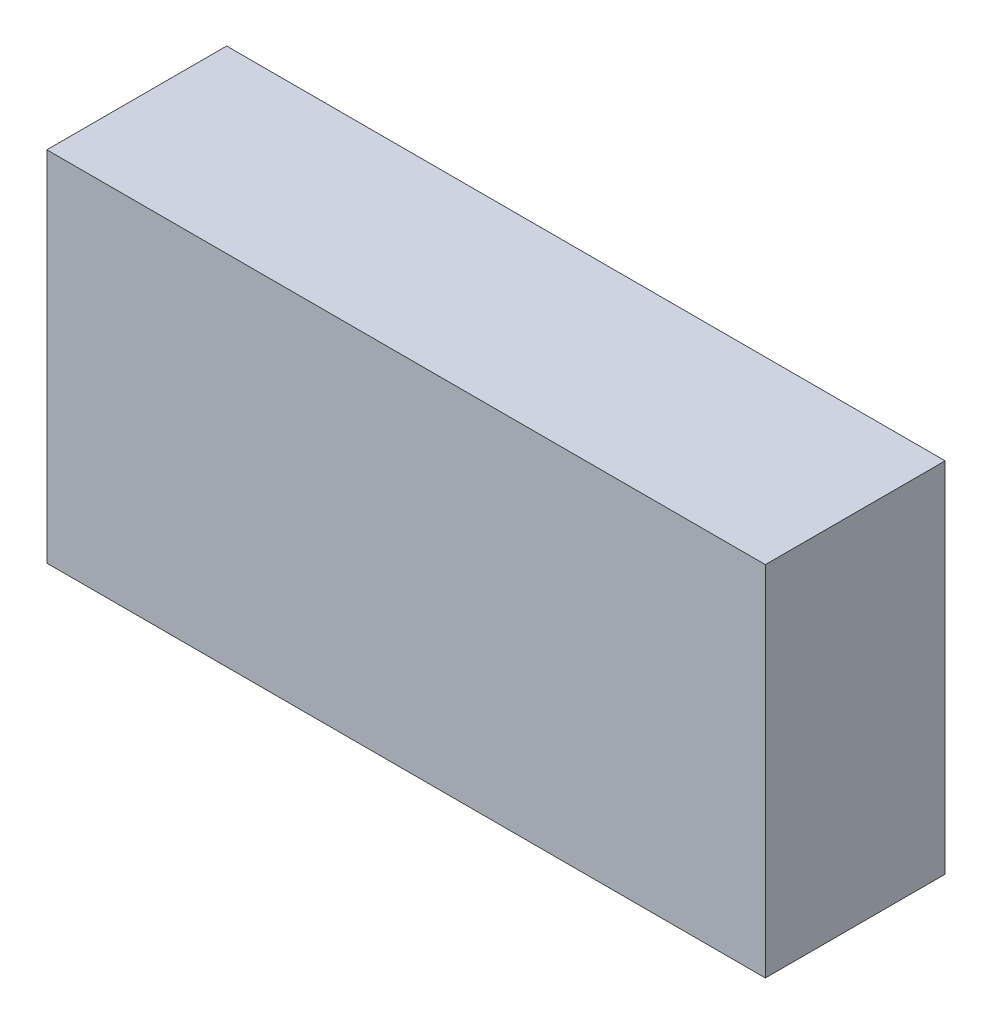
ISO-10303-21;
HEADER;
FILE_DESCRIPTION(('STEP AP214'),'2;1');
FILE_NAME('part.step','',(''),(''),'','','');
FILE_SCHEMA(('AUTOMOTIVE_DESIGN { 1 0 10303 214 1 1 1 1 }'));
ENDSEC;
DATA;
#1=APPLICATION_CONTEXT('core data for automotive mechanical design processes');
#2=APPLICATION_PROTOCOL_DEFINITION('international standard','automotive_design',2000,#1);
#3=PRODUCT_CONTEXT('',#1,'mechanical');
#4=PRODUCT('Part','Part','',(#3));
#5=PRODUCT_RELATED_PRODUCT_CATEGORY('part','',(#4));
#6=PRODUCT_DEFINITION_FORMATION('','',#4);
#7=PRODUCT_DEFINITION_CONTEXT('part definition',#1,'design');
#8=PRODUCT_DEFINITION('design','',#6,#7);
#9=PRODUCT_DEFINITION_SHAPE('','',#8);
#10=(LENGTH_UNIT() NAMED_UNIT(*) SI_UNIT(.MILLI.,.METRE.));
#11=(NAMED_UNIT(*) PLANE_ANGLE_UNIT() SI_UNIT($,.RADIAN.));
#12=(NAMED_UNIT(*) SI_UNIT($,.STERADIAN.) SOLID_ANGLE_UNIT());
#13=UNCERTAINTY_MEASURE_WITH_UNIT(LENGTH_MEASURE(1.E-05),#10,'distance_accuracy_value','');
#14=(GEOMETRIC_REPRESENTATION_CONTEXT(3) GLOBAL_UNCERTAINTY_ASSIGNED_CONTEXT((#13)) GLOBAL_UNIT_ASSIGNED_CONTEXT((#10,
#11,#12)) REPRESENTATION_CONTEXT('',''));
#15=CARTESIAN_POINT('',(0.,0.,0.));
#16=DIRECTION('',(0.,0.,1.));
#17=DIRECTION('',(1.,0.,0.));
#18=AXIS2_PLACEMENT_3D('',#15,#16,#17);
#19=CARTESIAN_POINT('',(-1.9984,1.0084,1.));
#20=DIRECTION('',(0.,0.,1.));
#21=DIRECTION('',(1.,0.,0.));
#22=AXIS2_PLACEMENT_3D('',#19,#20,#21);
#23=PLANE('',#22);
#24=DIRECTION('',(0.,1.,0.));
#25=VECTOR('',#24,1.);
#26=CARTESIAN_POINT('',(1.9984,1.0084,1.));
#27=LINE('',#26,#25);
#28=CARTESIAN_POINT('',(1.9984,1.0084,1.));
#29=VERTEX_POINT('',#28);
#30=CARTESIAN_POINT('',(1.9984,-0.983,1.));
#31=VERTEX_POINT('',#30);
#32=EDGE_CURVE('E53',#29,#31,#27,.F.);
#33=ORIENTED_EDGE('',*,*,#32,.F.);
#34=DIRECTION('',(1.,0.,0.));
#35=VECTOR('',#34,1.);
#36=CARTESIAN_POINT('',(-1.9984,1.0084,1.));
#37=LINE('',#36,#35);
#38=CARTESIAN_POINT('',(-1.9984,1.0084,1.));
#39=VERTEX_POINT('',#38);
#40=EDGE_CURVE('E68',#39,#29,#37,.T.);
#41=ORIENTED_EDGE('',*,*,#40,.F.);
#42=DIRECTION('',(0.,1.,0.));
#43=VECTOR('',#42,1.);
#44=CARTESIAN_POINT('',(-1.9984,-0.983,1.));
#45=LINE('',#44,#43);
#46=CARTESIAN_POINT('',(-1.9984,-0.983,1.));
#47=VERTEX_POINT('',#46);
#48=EDGE_CURVE('E20',#47,#39,#45,.T.);
#49=ORIENTED_EDGE('',*,*,#48,.F.);
#50=DIRECTION('',(1.,0.,0.));
#51=VECTOR('',#50,1.);
#52=CARTESIAN_POINT('',(1.9984,-0.983,1.));
#53=LINE('',#52,#51);
#54=EDGE_CURVE('E58',#31,#47,#53,.F.);
#55=ORIENTED_EDGE('',*,*,#54,.F.);
#56=EDGE_LOOP('',(#33,#41,#49,#55));
#57=FACE_BOUND('',#56,.T.);
#58=ADVANCED_FACE('F17',(#57),#23,.T.);
#59=CARTESIAN_POINT('',(-1.9984,-0.983,0.));
#60=DIRECTION('',(-1.,0.,0.));
#61=DIRECTION('',(0.,0.,1.));
#62=AXIS2_PLACEMENT_3D('',#59,#60,#61);
#63=PLANE('',#62);
#64=DIRECTION('',(0.,0.,1.));
#65=VECTOR('',#64,1.);
#66=CARTESIAN_POINT('',(-1.9984,1.0084,0.));
#67=LINE('',#66,#65);
#68=CARTESIAN_POINT('',(-1.9984,1.0084,0.));
#69=VERTEX_POINT('',#68);
#70=EDGE_CURVE('E79',#69,#39,#67,.T.);
#71=ORIENTED_EDGE('',*,*,#70,.F.);
#72=DIRECTION('',(0.,1.,0.));
#73=VECTOR('',#72,1.);
#74=CARTESIAN_POINT('',(-1.9984,1.0084,0.));
#75=LINE('',#74,#73);
#76=CARTESIAN_POINT('',(-1.9984,-0.983,0.));
#77=VERTEX_POINT('',#76);
#78=EDGE_CURVE('E74',#69,#77,#75,.F.);
#79=ORIENTED_EDGE('',*,*,#78,.T.);
#80=DIRECTION('',(0.,0.,-1.));
#81=VECTOR('',#80,1.);
#82=CARTESIAN_POINT('',(-1.9984,-0.983,0.));
#83=LINE('',#82,#81);
#84=EDGE_CURVE('E63',#47,#77,#83,.T.);
#85=ORIENTED_EDGE('',*,*,#84,.F.);
#86=ORIENTED_EDGE('',*,*,#48,.T.);
#87=EDGE_LOOP('',(#71,#79,#85,#86));
#88=FACE_BOUND('',#87,.T.);
#89=ADVANCED_FACE('F73',(#88),#63,.T.);
#90=CARTESIAN_POINT('',(1.9984,-0.983,0.));
#91=DIRECTION('',(0.,-1.,0.));
#92=DIRECTION('',(0.,0.,-1.));
#93=AXIS2_PLACEMENT_3D('',#90,#91,#92);
#94=PLANE('',#93);
#95=ORIENTED_EDGE('',*,*,#84,.T.);
#96=DIRECTION('',(1.,0.,0.));
#97=VECTOR('',#96,1.);
#98=CARTESIAN_POINT('',(-1.9984,-0.983,0.));
#99=LINE('',#98,#97);
#100=CARTESIAN_POINT('',(1.9984,-0.983,0.));
#101=VERTEX_POINT('',#100);
#102=EDGE_CURVE('E84',#77,#101,#99,.T.);
#103=ORIENTED_EDGE('',*,*,#102,.T.);
#104=DIRECTION('',(0.,0.,-1.));
#105=VECTOR('',#104,1.);
#106=CARTESIAN_POINT('',(1.9984,-0.983,0.));
#107=LINE('',#106,#105);
#108=EDGE_CURVE('E65',#31,#101,#107,.T.);
#109=ORIENTED_EDGE('',*,*,#108,.F.);
#110=ORIENTED_EDGE('',*,*,#54,.T.);
#111=EDGE_LOOP('',(#95,#103,#109,#110));
#112=FACE_BOUND('',#111,.T.);
#113=ADVANCED_FACE('F60',(#112),#94,.T.);
#114=CARTESIAN_POINT('',(1.9984,1.0084,0.));
#115=DIRECTION('',(1.,0.,0.));
#116=DIRECTION('',(0.,0.,-1.));
#117=AXIS2_PLACEMENT_3D('',#114,#115,#116);
#118=PLANE('',#117);
#119=ORIENTED_EDGE('',*,*,#108,.T.);
#120=DIRECTION('',(0.,1.,0.));
#121=VECTOR('',#120,1.);
#122=CARTESIAN_POINT('',(1.9984,1.0084,0.));
#123=LINE('',#122,#121);
#124=CARTESIAN_POINT('',(1.9984,1.0084,0.));
#125=VERTEX_POINT('',#124);
#126=EDGE_CURVE('E26',#101,#125,#123,.T.);
#127=ORIENTED_EDGE('',*,*,#126,.T.);
#128=DIRECTION('',(0.,0.,1.));
#129=VECTOR('',#128,1.);
#130=CARTESIAN_POINT('',(1.9984,1.0084,0.));
#131=LINE('',#130,#129);
#132=EDGE_CURVE('E34',#29,#125,#131,.F.);
#133=ORIENTED_EDGE('',*,*,#132,.F.);
#134=ORIENTED_EDGE('',*,*,#32,.T.);
#135=EDGE_LOOP('',(#119,#127,#133,#134));
#136=FACE_BOUND('',#135,.T.);
#137=ADVANCED_FACE('F88',(#136),#118,.T.);
#138=CARTESIAN_POINT('',(-1.9984,1.0084,0.));
#139=DIRECTION('',(0.,1.,0.));
#140=DIRECTION('',(0.,0.,1.));
#141=AXIS2_PLACEMENT_3D('',#138,#139,#140);
#142=PLANE('',#141);
#143=ORIENTED_EDGE('',*,*,#132,.T.);
#144=DIRECTION('',(1.,0.,0.));
#145=VECTOR('',#144,1.);
#146=CARTESIAN_POINT('',(-1.9984,1.0084,0.));
#147=LINE('',#146,#145);
#148=EDGE_CURVE('E11',#125,#69,#147,.F.);
#149=ORIENTED_EDGE('',*,*,#148,.T.);
#150=ORIENTED_EDGE('',*,*,#70,.T.);
#151=ORIENTED_EDGE('',*,*,#40,.T.);
#152=EDGE_LOOP('',(#143,#149,#150,#151));
#153=FACE_BOUND('',#152,.T.);
#154=ADVANCED_FACE('F91',(#153),#142,.T.);
#155=CARTESIAN_POINT('',(-1.9984,1.0084,0.));
#156=DIRECTION('',(0.,0.,1.));
#157=DIRECTION('',(1.,0.,0.));
#158=AXIS2_PLACEMENT_3D('',#155,#156,#157);
#159=PLANE('',#158);
#160=ORIENTED_EDGE('',*,*,#126,.F.);
#161=ORIENTED_EDGE('',*,*,#102,.F.);
#162=ORIENTED_EDGE('',*,*,#78,.F.);
#163=ORIENTED_EDGE('',*,*,#148,.F.);
#164=EDGE_LOOP('',(#160,#161,#162,#163));
#165=FACE_BOUND('',#164,.T.);
#166=ADVANCED_FACE('F90',(#165),#159,.F.);
#167=CLOSED_SHELL('',(#58,#89,#113,#137,#154,#166));
#168=MANIFOLD_SOLID_BREP('B1',#167);
#169=ADVANCED_BREP_SHAPE_REPRESENTATION('',(#18,#168),#14);
#170=SHAPE_DEFINITION_REPRESENTATION(#9,#169);
ENDSEC;
END-ISO-10303-21;
